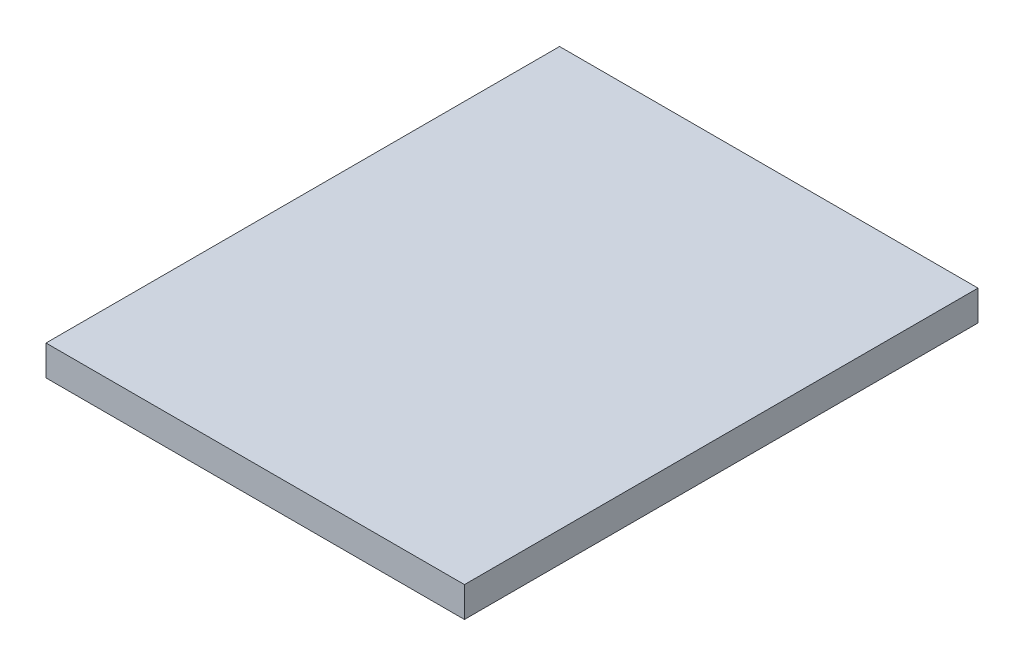
ISO-10303-21;
HEADER;
FILE_DESCRIPTION(('STEP AP214'),'2;1');
FILE_NAME('part.step','',(''),(''),'','','');
FILE_SCHEMA(('AUTOMOTIVE_DESIGN { 1 0 10303 214 1 1 1 1 }'));
ENDSEC;
DATA;
#1=APPLICATION_CONTEXT('core data for automotive mechanical design processes');
#2=APPLICATION_PROTOCOL_DEFINITION('international standard','automotive_design',2000,#1);
#3=PRODUCT_CONTEXT('',#1,'mechanical');
#4=PRODUCT('Part','Part','',(#3));
#5=PRODUCT_RELATED_PRODUCT_CATEGORY('part','',(#4));
#6=PRODUCT_DEFINITION_FORMATION('','',#4);
#7=PRODUCT_DEFINITION_CONTEXT('part definition',#1,'design');
#8=PRODUCT_DEFINITION('design','',#6,#7);
#9=PRODUCT_DEFINITION_SHAPE('','',#8);
#10=(LENGTH_UNIT() NAMED_UNIT(*) SI_UNIT(.MILLI.,.METRE.));
#11=(NAMED_UNIT(*) PLANE_ANGLE_UNIT() SI_UNIT($,.RADIAN.));
#12=(NAMED_UNIT(*) SI_UNIT($,.STERADIAN.) SOLID_ANGLE_UNIT());
#13=UNCERTAINTY_MEASURE_WITH_UNIT(LENGTH_MEASURE(1.E-05),#10,'distance_accuracy_value','');
#14=(GEOMETRIC_REPRESENTATION_CONTEXT(3) GLOBAL_UNCERTAINTY_ASSIGNED_CONTEXT((#13)) GLOBAL_UNIT_ASSIGNED_CONTEXT((#10,
#11,#12)) REPRESENTATION_CONTEXT('',''));
#15=CARTESIAN_POINT('',(0.,0.,0.));
#16=DIRECTION('',(0.,0.,1.));
#17=DIRECTION('',(1.,0.,0.));
#18=AXIS2_PLACEMENT_3D('',#15,#16,#17);
#19=CARTESIAN_POINT('',(-22.,3.18,-27.));
#20=DIRECTION('',(1.,0.,0.));
#21=DIRECTION('',(0.,0.,-1.));
#22=AXIS2_PLACEMENT_3D('',#19,#20,#21);
#23=PLANE('',#22);
#24=DIRECTION('',(0.,0.,1.));
#25=VECTOR('',#24,1.);
#26=CARTESIAN_POINT('',(-22.,0.,-27.));
#27=LINE('',#26,#25);
#28=CARTESIAN_POINT('',(-22.,0.,-27.));
#29=VERTEX_POINT('',#28);
#30=CARTESIAN_POINT('',(-22.,0.,27.));
#31=VERTEX_POINT('',#30);
#32=EDGE_CURVE('E95',#29,#31,#27,.T.);
#33=ORIENTED_EDGE('',*,*,#32,.T.);
#34=DIRECTION('',(0.,-1.,0.));
#35=VECTOR('',#34,1.);
#36=CARTESIAN_POINT('',(-22.,3.18,27.));
#37=LINE('',#36,#35);
#38=CARTESIAN_POINT('',(-22.,3.18,27.));
#39=VERTEX_POINT('',#38);
#40=EDGE_CURVE('E11',#39,#31,#37,.T.);
#41=ORIENTED_EDGE('',*,*,#40,.F.);
#42=DIRECTION('',(0.,0.,1.));
#43=VECTOR('',#42,1.);
#44=CARTESIAN_POINT('',(-22.,3.18,-27.));
#45=LINE('',#44,#43);
#46=CARTESIAN_POINT('',(-22.,3.18,-27.));
#47=VERTEX_POINT('',#46);
#48=EDGE_CURVE('E83',#47,#39,#45,.T.);
#49=ORIENTED_EDGE('',*,*,#48,.F.);
#50=DIRECTION('',(0.,-1.,0.));
#51=VECTOR('',#50,1.);
#52=CARTESIAN_POINT('',(-22.,3.18,-27.));
#53=LINE('',#52,#51);
#54=EDGE_CURVE('E91',#47,#29,#53,.T.);
#55=ORIENTED_EDGE('',*,*,#54,.T.);
#56=EDGE_LOOP('',(#33,#41,#49,#55));
#57=FACE_BOUND('',#56,.T.);
#58=ADVANCED_FACE('F32',(#57),#23,.F.);
#59=CARTESIAN_POINT('',(-22.,3.18,27.));
#60=DIRECTION('',(0.,0.,-1.));
#61=DIRECTION('',(-1.,0.,0.));
#62=AXIS2_PLACEMENT_3D('',#59,#60,#61);
#63=PLANE('',#62);
#64=DIRECTION('',(1.,0.,0.));
#65=VECTOR('',#64,1.);
#66=CARTESIAN_POINT('',(-22.,0.,27.));
#67=LINE('',#66,#65);
#68=CARTESIAN_POINT('',(22.,0.,27.));
#69=VERTEX_POINT('',#68);
#70=EDGE_CURVE('E87',#31,#69,#67,.T.);
#71=ORIENTED_EDGE('',*,*,#70,.T.);
#72=DIRECTION('',(0.,-1.,0.));
#73=VECTOR('',#72,1.);
#74=CARTESIAN_POINT('',(22.,3.18,27.));
#75=LINE('',#74,#73);
#76=CARTESIAN_POINT('',(22.,3.18,27.));
#77=VERTEX_POINT('',#76);
#78=EDGE_CURVE('E40',#77,#69,#75,.T.);
#79=ORIENTED_EDGE('',*,*,#78,.F.);
#80=DIRECTION('',(1.,0.,0.));
#81=VECTOR('',#80,1.);
#82=CARTESIAN_POINT('',(-22.,3.18,27.));
#83=LINE('',#82,#81);
#84=EDGE_CURVE('E78',#39,#77,#83,.T.);
#85=ORIENTED_EDGE('',*,*,#84,.F.);
#86=ORIENTED_EDGE('',*,*,#40,.T.);
#87=EDGE_LOOP('',(#71,#79,#85,#86));
#88=FACE_BOUND('',#87,.T.);
#89=ADVANCED_FACE('F86',(#88),#63,.F.);
#90=CARTESIAN_POINT('',(22.,3.18,-27.));
#91=DIRECTION('',(-1.,0.,0.));
#92=DIRECTION('',(0.,0.,1.));
#93=AXIS2_PLACEMENT_3D('',#90,#91,#92);
#94=PLANE('',#93);
#95=DIRECTION('',(0.,0.,-1.));
#96=VECTOR('',#95,1.);
#97=CARTESIAN_POINT('',(22.,0.,-27.));
#98=LINE('',#97,#96);
#99=CARTESIAN_POINT('',(22.,0.,-27.));
#100=VERTEX_POINT('',#99);
#101=EDGE_CURVE('E65',#69,#100,#98,.T.);
#102=ORIENTED_EDGE('',*,*,#101,.T.);
#103=DIRECTION('',(0.,-1.,0.));
#104=VECTOR('',#103,1.);
#105=CARTESIAN_POINT('',(22.,3.18,-27.));
#106=LINE('',#105,#104);
#107=CARTESIAN_POINT('',(22.,3.18,-27.));
#108=VERTEX_POINT('',#107);
#109=EDGE_CURVE('E88',#108,#100,#106,.T.);
#110=ORIENTED_EDGE('',*,*,#109,.F.);
#111=DIRECTION('',(0.,0.,-1.));
#112=VECTOR('',#111,1.);
#113=CARTESIAN_POINT('',(22.,3.18,-27.));
#114=LINE('',#113,#112);
#115=EDGE_CURVE('E81',#77,#108,#114,.T.);
#116=ORIENTED_EDGE('',*,*,#115,.F.);
#117=ORIENTED_EDGE('',*,*,#78,.T.);
#118=EDGE_LOOP('',(#102,#110,#116,#117));
#119=FACE_BOUND('',#118,.T.);
#120=ADVANCED_FACE('F89',(#119),#94,.F.);
#121=CARTESIAN_POINT('',(-22.,3.18,-27.));
#122=DIRECTION('',(0.,0.,1.));
#123=DIRECTION('',(1.,0.,0.));
#124=AXIS2_PLACEMENT_3D('',#121,#122,#123);
#125=PLANE('',#124);
#126=DIRECTION('',(-1.,0.,0.));
#127=VECTOR('',#126,1.);
#128=CARTESIAN_POINT('',(-22.,0.,-27.));
#129=LINE('',#128,#127);
#130=EDGE_CURVE('E71',#100,#29,#129,.T.);
#131=ORIENTED_EDGE('',*,*,#130,.T.);
#132=ORIENTED_EDGE('',*,*,#54,.F.);
#133=DIRECTION('',(-1.,0.,0.));
#134=VECTOR('',#133,1.);
#135=CARTESIAN_POINT('',(-22.,3.18,-27.));
#136=LINE('',#135,#134);
#137=EDGE_CURVE('E48',#108,#47,#136,.T.);
#138=ORIENTED_EDGE('',*,*,#137,.F.);
#139=ORIENTED_EDGE('',*,*,#109,.T.);
#140=EDGE_LOOP('',(#131,#132,#138,#139));
#141=FACE_BOUND('',#140,.T.);
#142=ADVANCED_FACE('F102',(#141),#125,.F.);
#143=CARTESIAN_POINT('',(0.,3.18,0.));
#144=DIRECTION('',(0.,1.,0.));
#145=DIRECTION('',(0.,0.,1.));
#146=AXIS2_PLACEMENT_3D('',#143,#144,#145);
#147=PLANE('',#146);
#148=ORIENTED_EDGE('',*,*,#48,.T.);
#149=ORIENTED_EDGE('',*,*,#84,.T.);
#150=ORIENTED_EDGE('',*,*,#115,.T.);
#151=ORIENTED_EDGE('',*,*,#137,.T.);
#152=EDGE_LOOP('',(#148,#149,#150,#151));
#153=FACE_BOUND('',#152,.T.);
#154=ADVANCED_FACE('F79',(#153),#147,.T.);
#155=CARTESIAN_POINT('',(0.,0.,0.));
#156=DIRECTION('',(0.,1.,0.));
#157=DIRECTION('',(0.,0.,1.));
#158=AXIS2_PLACEMENT_3D('',#155,#156,#157);
#159=PLANE('',#158);
#160=ORIENTED_EDGE('',*,*,#32,.F.);
#161=ORIENTED_EDGE('',*,*,#130,.F.);
#162=ORIENTED_EDGE('',*,*,#101,.F.);
#163=ORIENTED_EDGE('',*,*,#70,.F.);
#164=EDGE_LOOP('',(#160,#161,#162,#163));
#165=FACE_BOUND('',#164,.T.);
#166=ADVANCED_FACE('F105',(#165),#159,.F.);
#167=CLOSED_SHELL('',(#58,#89,#120,#142,#154,#166));
#168=MANIFOLD_SOLID_BREP('B2',#167);
#169=ADVANCED_BREP_SHAPE_REPRESENTATION('',(#18,#168),#14);
#170=SHAPE_DEFINITION_REPRESENTATION(#9,#169);
ENDSEC;
END-ISO-10303-21;
